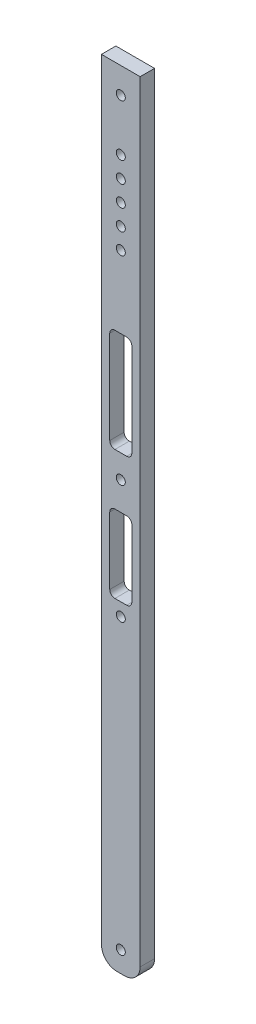
ISO-10303-21;
HEADER;
FILE_DESCRIPTION(('STEP AP214'),'2;1');
FILE_NAME('part.step','',(''),(''),'','','');
FILE_SCHEMA(('AUTOMOTIVE_DESIGN { 1 0 10303 214 1 1 1 1 }'));
ENDSEC;
DATA;
#1=APPLICATION_CONTEXT('core data for automotive mechanical design processes');
#2=APPLICATION_PROTOCOL_DEFINITION('international standard','automotive_design',2000,#1);
#3=PRODUCT_CONTEXT('',#1,'mechanical');
#4=PRODUCT('Part','Part','',(#3));
#5=PRODUCT_RELATED_PRODUCT_CATEGORY('part','',(#4));
#6=PRODUCT_DEFINITION_FORMATION('','',#4);
#7=PRODUCT_DEFINITION_CONTEXT('part definition',#1,'design');
#8=PRODUCT_DEFINITION('design','',#6,#7);
#9=PRODUCT_DEFINITION_SHAPE('','',#8);
#10=(LENGTH_UNIT() NAMED_UNIT(*) SI_UNIT(.MILLI.,.METRE.));
#11=(NAMED_UNIT(*) PLANE_ANGLE_UNIT() SI_UNIT($,.RADIAN.));
#12=(NAMED_UNIT(*) SI_UNIT($,.STERADIAN.) SOLID_ANGLE_UNIT());
#13=UNCERTAINTY_MEASURE_WITH_UNIT(LENGTH_MEASURE(1.E-05),#10,'distance_accuracy_value','');
#14=(GEOMETRIC_REPRESENTATION_CONTEXT(3) GLOBAL_UNCERTAINTY_ASSIGNED_CONTEXT((#13)) GLOBAL_UNIT_ASSIGNED_CONTEXT((#10,
#11,#12)) REPRESENTATION_CONTEXT('',''));
#15=CARTESIAN_POINT('',(0.,0.,0.));
#16=DIRECTION('',(0.,0.,1.));
#17=DIRECTION('',(1.,0.,0.));
#18=AXIS2_PLACEMENT_3D('',#15,#16,#17);
#19=CARTESIAN_POINT('',(-5.18917009837565,-216.502530885381,5.588));
#20=DIRECTION('',(1.,0.,0.));
#21=DIRECTION('',(0.,0.,-1.));
#22=AXIS2_PLACEMENT_3D('',#19,#20,#21);
#23=PLANE('',#22);
#24=DIRECTION('',(0.,-1.,0.));
#25=VECTOR('',#24,1.);
#26=CARTESIAN_POINT('',(-5.18917009837565,-216.502530885381,0.));
#27=LINE('',#26,#25);
#28=CARTESIAN_POINT('',(-5.18917009837565,88.2974691146191,0.));
#29=VERTEX_POINT('',#28);
#30=CARTESIAN_POINT('',(-5.18917009837565,-210.502530885381,0.));
#31=VERTEX_POINT('',#30);
#32=EDGE_CURVE('E373',#29,#31,#27,.T.);
#33=ORIENTED_EDGE('',*,*,#32,.T.);
#34=DIRECTION('',(0.,0.,-1.));
#35=VECTOR('',#34,1.);
#36=CARTESIAN_POINT('',(-5.18917009837565,-210.502530885381,5.588));
#37=LINE('',#36,#35);
#38=CARTESIAN_POINT('',(-5.18917009837565,-210.502530885381,5.588));
#39=VERTEX_POINT('',#38);
#40=EDGE_CURVE('E11',#31,#39,#37,.F.);
#41=ORIENTED_EDGE('',*,*,#40,.T.);
#42=DIRECTION('',(0.,-1.,0.));
#43=VECTOR('',#42,1.);
#44=CARTESIAN_POINT('',(-5.18917009837565,-216.502530885381,5.588));
#45=LINE('',#44,#43);
#46=CARTESIAN_POINT('',(-5.18917009837565,88.2974691146191,5.588));
#47=VERTEX_POINT('',#46);
#48=EDGE_CURVE('E376',#47,#39,#45,.T.);
#49=ORIENTED_EDGE('',*,*,#48,.F.);
#50=DIRECTION('',(0.,0.,-1.));
#51=VECTOR('',#50,1.);
#52=CARTESIAN_POINT('',(-5.18917009837565,88.2974691146191,5.588));
#53=LINE('',#52,#51);
#54=EDGE_CURVE('E385',#47,#29,#53,.T.);
#55=ORIENTED_EDGE('',*,*,#54,.T.);
#56=EDGE_LOOP('',(#33,#41,#49,#55));
#57=FACE_BOUND('',#56,.T.);
#58=ADVANCED_FACE('F33',(#57),#23,.F.);
#59=CARTESIAN_POINT('',(-5.18917009837565,-216.502530885381,5.588));
#60=DIRECTION('',(0.,1.,0.));
#61=DIRECTION('',(0.,0.,1.));
#62=AXIS2_PLACEMENT_3D('',#59,#60,#61);
#63=PLANE('',#62);
#64=DIRECTION('',(1.,0.,0.));
#65=VECTOR('',#64,1.);
#66=CARTESIAN_POINT('',(-5.18917009837565,-216.502530885381,0.));
#67=LINE('',#66,#65);
#68=CARTESIAN_POINT('',(0.810829901624352,-216.502530885381,0.));
#69=VERTEX_POINT('',#68);
#70=CARTESIAN_POINT('',(3.81082990162435,-216.502530885381,0.));
#71=VERTEX_POINT('',#70);
#72=EDGE_CURVE('E387',#69,#71,#67,.T.);
#73=ORIENTED_EDGE('',*,*,#72,.T.);
#74=DIRECTION('',(0.,0.,-1.));
#75=VECTOR('',#74,1.);
#76=CARTESIAN_POINT('',(3.81082990162435,-216.502530885381,5.588));
#77=LINE('',#76,#75);
#78=CARTESIAN_POINT('',(3.81082990162435,-216.502530885381,5.588));
#79=VERTEX_POINT('',#78);
#80=EDGE_CURVE('E54',#71,#79,#77,.F.);
#81=ORIENTED_EDGE('',*,*,#80,.T.);
#82=DIRECTION('',(1.,0.,0.));
#83=VECTOR('',#82,1.);
#84=CARTESIAN_POINT('',(-5.18917009837565,-216.502530885381,5.588));
#85=LINE('',#84,#83);
#86=CARTESIAN_POINT('',(0.810829901624352,-216.502530885381,5.588));
#87=VERTEX_POINT('',#86);
#88=EDGE_CURVE('E378',#87,#79,#85,.T.);
#89=ORIENTED_EDGE('',*,*,#88,.F.);
#90=DIRECTION('',(0.,0.,-1.));
#91=VECTOR('',#90,1.);
#92=CARTESIAN_POINT('',(0.810829901624352,-216.502530885381,5.588));
#93=LINE('',#92,#91);
#94=EDGE_CURVE('E404',#87,#69,#93,.T.);
#95=ORIENTED_EDGE('',*,*,#94,.T.);
#96=EDGE_LOOP('',(#73,#81,#89,#95));
#97=FACE_BOUND('',#96,.T.);
#98=ADVANCED_FACE('F424',(#97),#63,.F.);
#99=CARTESIAN_POINT('',(9.81082990162435,-216.502530885381,5.588));
#100=DIRECTION('',(-1.,0.,0.));
#101=DIRECTION('',(0.,0.,1.));
#102=AXIS2_PLACEMENT_3D('',#99,#100,#101);
#103=PLANE('',#102);
#104=DIRECTION('',(0.,1.,0.));
#105=VECTOR('',#104,1.);
#106=CARTESIAN_POINT('',(9.81082990162435,-216.502530885381,5.588));
#107=LINE('',#106,#105);
#108=CARTESIAN_POINT('',(9.81082990162435,-210.502530885381,5.588));
#109=VERTEX_POINT('',#108);
#110=CARTESIAN_POINT('',(9.81082990162435,88.2974691146191,5.588));
#111=VERTEX_POINT('',#110);
#112=EDGE_CURVE('E381',#109,#111,#107,.T.);
#113=ORIENTED_EDGE('',*,*,#112,.F.);
#114=DIRECTION('',(0.,0.,-1.));
#115=VECTOR('',#114,1.);
#116=CARTESIAN_POINT('',(9.81082990162435,-210.502530885381,5.588));
#117=LINE('',#116,#115);
#118=CARTESIAN_POINT('',(9.81082990162435,-210.502530885381,0.));
#119=VERTEX_POINT('',#118);
#120=EDGE_CURVE('E397',#109,#119,#117,.T.);
#121=ORIENTED_EDGE('',*,*,#120,.T.);
#122=DIRECTION('',(0.,1.,0.));
#123=VECTOR('',#122,1.);
#124=CARTESIAN_POINT('',(9.81082990162435,-216.502530885381,0.));
#125=LINE('',#124,#123);
#126=CARTESIAN_POINT('',(9.81082990162435,88.2974691146191,0.));
#127=VERTEX_POINT('',#126);
#128=EDGE_CURVE('E389',#119,#127,#125,.T.);
#129=ORIENTED_EDGE('',*,*,#128,.T.);
#130=DIRECTION('',(0.,0.,-1.));
#131=VECTOR('',#130,1.);
#132=CARTESIAN_POINT('',(9.81082990162435,88.2974691146191,5.588));
#133=LINE('',#132,#131);
#134=EDGE_CURVE('E394',#111,#127,#133,.T.);
#135=ORIENTED_EDGE('',*,*,#134,.F.);
#136=EDGE_LOOP('',(#113,#121,#129,#135));
#137=FACE_BOUND('',#136,.T.);
#138=ADVANCED_FACE('F417',(#137),#103,.F.);
#139=CARTESIAN_POINT('',(-5.18917009837565,88.2974691146191,5.588));
#140=DIRECTION('',(0.,-1.,0.));
#141=DIRECTION('',(0.,0.,-1.));
#142=AXIS2_PLACEMENT_3D('',#139,#140,#141);
#143=PLANE('',#142);
#144=DIRECTION('',(-1.,0.,0.));
#145=VECTOR('',#144,1.);
#146=CARTESIAN_POINT('',(-5.18917009837565,88.2974691146191,0.));
#147=LINE('',#146,#145);
#148=EDGE_CURVE('E379',#127,#29,#147,.T.);
#149=ORIENTED_EDGE('',*,*,#148,.T.);
#150=ORIENTED_EDGE('',*,*,#54,.F.);
#151=DIRECTION('',(-1.,0.,0.));
#152=VECTOR('',#151,1.);
#153=CARTESIAN_POINT('',(-5.18917009837565,88.2974691146191,5.588));
#154=LINE('',#153,#152);
#155=EDGE_CURVE('E383',#111,#47,#154,.T.);
#156=ORIENTED_EDGE('',*,*,#155,.F.);
#157=ORIENTED_EDGE('',*,*,#134,.T.);
#158=EDGE_LOOP('',(#149,#150,#156,#157));
#159=FACE_BOUND('',#158,.T.);
#160=ADVANCED_FACE('F431',(#159),#143,.F.);
#161=CARTESIAN_POINT('',(0.,0.,5.588));
#162=DIRECTION('',(0.,0.,-1.));
#163=DIRECTION('',(-1.,0.,0.));
#164=AXIS2_PLACEMENT_3D('',#161,#162,#163);
#165=PLANE('',#164);
#166=CARTESIAN_POINT('',(2.31082990162435,-208.502530885381,5.588));
#167=DIRECTION('',(0.,0.,1.));
#168=DIRECTION('',(1.,0.,0.));
#169=AXIS2_PLACEMENT_3D('',#166,#167,#168);
#170=CIRCLE('',#169,1.75);
#171=CARTESIAN_POINT('',(4.06082990162435,-208.502530885381,5.588));
#172=VERTEX_POINT('',#171);
#173=EDGE_CURVE('E216',#172,#172,#170,.T.);
#174=ORIENTED_EDGE('',*,*,#173,.F.);
#175=EDGE_LOOP('',(#174));
#176=FACE_BOUND('',#175,.T.);
#177=DIRECTION('',(0.,1.,0.));
#178=VECTOR('',#177,1.);
#179=CARTESIAN_POINT('',(6.59217705413511,-3.70253088538092,5.588));
#180=LINE('',#179,#178);
#181=CARTESIAN_POINT('',(6.59217705413512,-39.7025308853809,5.588));
#182=VERTEX_POINT('',#181);
#183=CARTESIAN_POINT('',(6.59217705413511,-3.70253088538092,5.588));
#184=VERTEX_POINT('',#183);
#185=EDGE_CURVE('E233',#182,#184,#180,.T.);
#186=ORIENTED_EDGE('',*,*,#185,.F.);
#187=CARTESIAN_POINT('',(4.59217705413512,-39.7025308853809,5.588));
#188=DIRECTION('',(0.,0.,1.));
#189=DIRECTION('',(-1.,0.,0.));
#190=AXIS2_PLACEMENT_3D('',#187,#188,#189);
#191=CIRCLE('',#190,2.);
#192=CARTESIAN_POINT('',(4.5921770541351,-41.7025308853809,5.588));
#193=VERTEX_POINT('',#192);
#194=EDGE_CURVE('E191',#193,#182,#191,.T.);
#195=ORIENTED_EDGE('',*,*,#194,.F.);
#196=DIRECTION('',(1.,0.,0.));
#197=VECTOR('',#196,1.);
#198=CARTESIAN_POINT('',(0.029482749113633,-41.7025308853809,5.588));
#199=LINE('',#198,#197);
#200=CARTESIAN_POINT('',(0.0294827491136326,-41.7025308853809,5.588));
#201=VERTEX_POINT('',#200);
#202=EDGE_CURVE('E210',#201,#193,#199,.T.);
#203=ORIENTED_EDGE('',*,*,#202,.F.);
#204=CARTESIAN_POINT('',(0.0294827491136187,-39.7025308853809,5.588));
#205=DIRECTION('',(0.,0.,1.));
#206=DIRECTION('',(1.,0.,0.));
#207=AXIS2_PLACEMENT_3D('',#204,#205,#206);
#208=CIRCLE('',#207,2.);
#209=CARTESIAN_POINT('',(-1.97051725088638,-39.7025308853809,5.588));
#210=VERTEX_POINT('',#209);
#211=EDGE_CURVE('E213',#210,#201,#208,.T.);
#212=ORIENTED_EDGE('',*,*,#211,.F.);
#213=DIRECTION('',(0.,-1.,0.));
#214=VECTOR('',#213,1.);
#215=CARTESIAN_POINT('',(-1.97051725088639,-3.70253088538092,5.588));
#216=LINE('',#215,#214);
#217=CARTESIAN_POINT('',(-1.97051725088639,-3.70253088538092,5.588));
#218=VERTEX_POINT('',#217);
#219=EDGE_CURVE('E245',#218,#210,#216,.T.);
#220=ORIENTED_EDGE('',*,*,#219,.F.);
#221=CARTESIAN_POINT('',(0.0294827491136148,-3.70253088538091,5.588));
#222=DIRECTION('',(0.,0.,1.));
#223=DIRECTION('',(1.,0.,0.));
#224=AXIS2_PLACEMENT_3D('',#221,#222,#223);
#225=CIRCLE('',#224,2.);
#226=CARTESIAN_POINT('',(0.0294827491136287,-1.70253088538091,5.588));
#227=VERTEX_POINT('',#226);
#228=EDGE_CURVE('E242',#227,#218,#225,.T.);
#229=ORIENTED_EDGE('',*,*,#228,.F.);
#230=DIRECTION('',(-1.,0.,0.));
#231=VECTOR('',#230,1.);
#232=CARTESIAN_POINT('',(0.0294827491136287,-1.70253088538091,5.588));
#233=LINE('',#232,#231);
#234=CARTESIAN_POINT('',(4.5921770541351,-1.70253088538091,5.588));
#235=VERTEX_POINT('',#234);
#236=EDGE_CURVE('E239',#235,#227,#233,.T.);
#237=ORIENTED_EDGE('',*,*,#236,.F.);
#238=CARTESIAN_POINT('',(4.59217705413511,-3.70253088538091,5.588));
#239=DIRECTION('',(0.,0.,1.));
#240=DIRECTION('',(1.,0.,0.));
#241=AXIS2_PLACEMENT_3D('',#238,#239,#240);
#242=CIRCLE('',#241,2.);
#243=EDGE_CURVE('E236',#184,#235,#242,.T.);
#244=ORIENTED_EDGE('',*,*,#243,.F.);
#245=EDGE_LOOP('',(#186,#195,#203,#212,#220,#229,#237,#244));
#246=FACE_BOUND('',#245,.T.);
#247=DIRECTION('',(0.,1.,0.));
#248=VECTOR('',#247,1.);
#249=CARTESIAN_POINT('',(6.59217705413512,-63.7025308853809,5.588));
#250=LINE('',#249,#248);
#251=CARTESIAN_POINT('',(6.59217705413512,-89.7025308853809,5.588));
#252=VERTEX_POINT('',#251);
#253=CARTESIAN_POINT('',(6.59217705413512,-63.7025308853809,5.588));
#254=VERTEX_POINT('',#253);
#255=EDGE_CURVE('E291',#252,#254,#250,.T.);
#256=ORIENTED_EDGE('',*,*,#255,.F.);
#257=CARTESIAN_POINT('',(4.59217705413512,-89.7025308853809,5.588));
#258=DIRECTION('',(0.,0.,1.));
#259=DIRECTION('',(1.,0.,0.));
#260=AXIS2_PLACEMENT_3D('',#257,#258,#259);
#261=CIRCLE('',#260,2.);
#262=CARTESIAN_POINT('',(4.59217705413511,-91.7025308853809,5.588));
#263=VERTEX_POINT('',#262);
#264=EDGE_CURVE('E252',#263,#252,#261,.T.);
#265=ORIENTED_EDGE('',*,*,#264,.F.);
#266=DIRECTION('',(1.,0.,0.));
#267=VECTOR('',#266,1.);
#268=CARTESIAN_POINT('',(0.0294827491136378,-91.7025308853809,5.588));
#269=LINE('',#268,#267);
#270=CARTESIAN_POINT('',(0.0294827491136378,-91.7025308853809,5.588));
#271=VERTEX_POINT('',#270);
#272=EDGE_CURVE('E268',#271,#263,#269,.T.);
#273=ORIENTED_EDGE('',*,*,#272,.F.);
#274=CARTESIAN_POINT('',(0.0294827491136239,-89.7025308853809,5.588));
#275=DIRECTION('',(0.,0.,1.));
#276=DIRECTION('',(1.,0.,0.));
#277=AXIS2_PLACEMENT_3D('',#274,#275,#276);
#278=CIRCLE('',#277,2.);
#279=CARTESIAN_POINT('',(-1.97051725088638,-89.7025308853809,5.588));
#280=VERTEX_POINT('',#279);
#281=EDGE_CURVE('E306',#280,#271,#278,.T.);
#282=ORIENTED_EDGE('',*,*,#281,.F.);
#283=DIRECTION('',(0.,-1.,0.));
#284=VECTOR('',#283,1.);
#285=CARTESIAN_POINT('',(-1.97051725088638,-63.7025308853809,5.588));
#286=LINE('',#285,#284);
#287=CARTESIAN_POINT('',(-1.97051725088638,-63.7025308853809,5.588));
#288=VERTEX_POINT('',#287);
#289=EDGE_CURVE('E303',#288,#280,#286,.T.);
#290=ORIENTED_EDGE('',*,*,#289,.F.);
#291=CARTESIAN_POINT('',(0.0294827491136205,-63.7025308853809,5.588));
#292=DIRECTION('',(0.,0.,1.));
#293=DIRECTION('',(1.,0.,0.));
#294=AXIS2_PLACEMENT_3D('',#291,#292,#293);
#295=CIRCLE('',#294,2.);
#296=CARTESIAN_POINT('',(0.0294827491136344,-61.7025308853809,5.588));
#297=VERTEX_POINT('',#296);
#298=EDGE_CURVE('E300',#297,#288,#295,.T.);
#299=ORIENTED_EDGE('',*,*,#298,.F.);
#300=DIRECTION('',(-1.,0.,0.));
#301=VECTOR('',#300,1.);
#302=CARTESIAN_POINT('',(0.0294827491136344,-61.7025308853809,5.588));
#303=LINE('',#302,#301);
#304=CARTESIAN_POINT('',(4.59217705413511,-61.7025308853809,5.588));
#305=VERTEX_POINT('',#304);
#306=EDGE_CURVE('E297',#305,#297,#303,.T.);
#307=ORIENTED_EDGE('',*,*,#306,.F.);
#308=CARTESIAN_POINT('',(4.59217705413512,-63.7025308853809,5.588));
#309=DIRECTION('',(0.,0.,1.));
#310=DIRECTION('',(-1.,0.,0.));
#311=AXIS2_PLACEMENT_3D('',#308,#309,#310);
#312=CIRCLE('',#311,2.);
#313=EDGE_CURVE('E294',#254,#305,#312,.T.);
#314=ORIENTED_EDGE('',*,*,#313,.F.);
#315=EDGE_LOOP('',(#256,#265,#273,#282,#290,#299,#307,#314));
#316=FACE_BOUND('',#315,.T.);
#317=CARTESIAN_POINT('',(2.31082990162437,-96.7025308853809,5.588));
#318=DIRECTION('',(0.,0.,1.));
#319=DIRECTION('',(1.,0.,0.));
#320=AXIS2_PLACEMENT_3D('',#317,#318,#319);
#321=CIRCLE('',#320,1.75);
#322=CARTESIAN_POINT('',(4.06082990162438,-96.7025308853809,5.588));
#323=VERTEX_POINT('',#322);
#324=EDGE_CURVE('E313',#323,#323,#321,.T.);
#325=ORIENTED_EDGE('',*,*,#324,.F.);
#326=EDGE_LOOP('',(#325));
#327=FACE_BOUND('',#326,.T.);
#328=CARTESIAN_POINT('',(2.31082990162437,-50.7628452094588,5.588));
#329=DIRECTION('',(0.,0.,1.));
#330=DIRECTION('',(1.,0.,0.));
#331=AXIS2_PLACEMENT_3D('',#328,#329,#330);
#332=CIRCLE('',#331,1.75);
#333=CARTESIAN_POINT('',(4.06082990162437,-50.7628452094588,5.588));
#334=VERTEX_POINT('',#333);
#335=EDGE_CURVE('E331',#334,#334,#332,.T.);
#336=ORIENTED_EDGE('',*,*,#335,.F.);
#337=EDGE_LOOP('',(#336));
#338=FACE_BOUND('',#337,.T.);
#339=CARTESIAN_POINT('',(2.31082990162436,26.2974691146191,5.588));
#340=DIRECTION('',(0.,0.,1.));
#341=DIRECTION('',(1.,0.,0.));
#342=AXIS2_PLACEMENT_3D('',#339,#340,#341);
#343=CIRCLE('',#342,1.75);
#344=CARTESIAN_POINT('',(4.06082990162436,26.2974691146191,5.588));
#345=VERTEX_POINT('',#344);
#346=EDGE_CURVE('E337',#345,#345,#343,.T.);
#347=ORIENTED_EDGE('',*,*,#346,.F.);
#348=EDGE_LOOP('',(#347));
#349=FACE_BOUND('',#348,.T.);
#350=CARTESIAN_POINT('',(2.31082990162436,34.2974691146191,5.588));
#351=DIRECTION('',(0.,0.,1.));
#352=DIRECTION('',(1.,0.,0.));
#353=AXIS2_PLACEMENT_3D('',#350,#351,#352);
#354=CIRCLE('',#353,1.75);
#355=CARTESIAN_POINT('',(4.06082990162436,34.2974691146191,5.588));
#356=VERTEX_POINT('',#355);
#357=EDGE_CURVE('E343',#356,#356,#354,.T.);
#358=ORIENTED_EDGE('',*,*,#357,.F.);
#359=EDGE_LOOP('',(#358));
#360=FACE_BOUND('',#359,.T.);
#361=CARTESIAN_POINT('',(2.31082990162436,42.2974691146191,5.588));
#362=DIRECTION('',(0.,0.,1.));
#363=DIRECTION('',(1.,0.,0.));
#364=AXIS2_PLACEMENT_3D('',#361,#362,#363);
#365=CIRCLE('',#364,1.75);
#366=CARTESIAN_POINT('',(4.06082990162436,42.2974691146191,5.588));
#367=VERTEX_POINT('',#366);
#368=EDGE_CURVE('E349',#367,#367,#365,.T.);
#369=ORIENTED_EDGE('',*,*,#368,.F.);
#370=EDGE_LOOP('',(#369));
#371=FACE_BOUND('',#370,.T.);
#372=CARTESIAN_POINT('',(2.31082990162436,50.2974691146191,5.588));
#373=DIRECTION('',(0.,0.,1.));
#374=DIRECTION('',(1.,0.,0.));
#375=AXIS2_PLACEMENT_3D('',#372,#373,#374);
#376=CIRCLE('',#375,1.75);
#377=CARTESIAN_POINT('',(4.06082990162436,50.2974691146191,5.588));
#378=VERTEX_POINT('',#377);
#379=EDGE_CURVE('E355',#378,#378,#376,.T.);
#380=ORIENTED_EDGE('',*,*,#379,.F.);
#381=EDGE_LOOP('',(#380));
#382=FACE_BOUND('',#381,.T.);
#383=CARTESIAN_POINT('',(2.31082990162436,58.2974691146191,5.588));
#384=DIRECTION('',(0.,0.,1.));
#385=DIRECTION('',(1.,0.,0.));
#386=AXIS2_PLACEMENT_3D('',#383,#384,#385);
#387=CIRCLE('',#386,1.75);
#388=CARTESIAN_POINT('',(4.06082990162436,58.2974691146191,5.588));
#389=VERTEX_POINT('',#388);
#390=EDGE_CURVE('E361',#389,#389,#387,.T.);
#391=ORIENTED_EDGE('',*,*,#390,.F.);
#392=EDGE_LOOP('',(#391));
#393=FACE_BOUND('',#392,.T.);
#394=CARTESIAN_POINT('',(2.31082990162435,78.2974691146191,5.588));
#395=DIRECTION('',(0.,0.,1.));
#396=DIRECTION('',(1.,0.,0.));
#397=AXIS2_PLACEMENT_3D('',#394,#395,#396);
#398=CIRCLE('',#397,1.75);
#399=CARTESIAN_POINT('',(4.06082990162435,78.2974691146191,5.588));
#400=VERTEX_POINT('',#399);
#401=EDGE_CURVE('E367',#400,#400,#398,.T.);
#402=ORIENTED_EDGE('',*,*,#401,.F.);
#403=EDGE_LOOP('',(#402));
#404=FACE_BOUND('',#403,.T.);
#405=ORIENTED_EDGE('',*,*,#88,.T.);
#406=CARTESIAN_POINT('',(3.81082990162435,-210.502530885381,5.588));
#407=DIRECTION('',(0.,0.,-1.));
#408=DIRECTION('',(-1.,0.,0.));
#409=AXIS2_PLACEMENT_3D('',#406,#407,#408);
#410=CIRCLE('',#409,6.);
#411=EDGE_CURVE('E41',#79,#109,#410,.F.);
#412=ORIENTED_EDGE('',*,*,#411,.T.);
#413=ORIENTED_EDGE('',*,*,#112,.T.);
#414=ORIENTED_EDGE('',*,*,#155,.T.);
#415=ORIENTED_EDGE('',*,*,#48,.T.);
#416=CARTESIAN_POINT('',(0.810829901624352,-210.502530885381,5.588));
#417=DIRECTION('',(0.,0.,-1.));
#418=DIRECTION('',(-1.,0.,0.));
#419=AXIS2_PLACEMENT_3D('',#416,#417,#418);
#420=CIRCLE('',#419,6.);
#421=EDGE_CURVE('E408',#39,#87,#420,.F.);
#422=ORIENTED_EDGE('',*,*,#421,.T.);
#423=EDGE_LOOP('',(#405,#412,#413,#414,#415,#422));
#424=FACE_BOUND('',#423,.T.);
#425=ADVANCED_FACE('F412',(#176,#246,#316,#327,#338,#349,#360,#371,#382,#393,#404,#424),#165,.F.);
#426=CARTESIAN_POINT('',(0.,0.,0.));
#427=DIRECTION('',(0.,0.,-1.));
#428=DIRECTION('',(-1.,0.,0.));
#429=AXIS2_PLACEMENT_3D('',#426,#427,#428);
#430=PLANE('',#429);
#431=CARTESIAN_POINT('',(2.31082990162435,-208.502530885381,0.));
#432=DIRECTION('',(0.,0.,1.));
#433=DIRECTION('',(1.,0.,0.));
#434=AXIS2_PLACEMENT_3D('',#431,#432,#433);
#435=CIRCLE('',#434,1.75);
#436=CARTESIAN_POINT('',(4.06082990162435,-208.502530885381,0.));
#437=VERTEX_POINT('',#436);
#438=EDGE_CURVE('E234',#437,#437,#435,.T.);
#439=ORIENTED_EDGE('',*,*,#438,.T.);
#440=EDGE_LOOP('',(#439));
#441=FACE_BOUND('',#440,.T.);
#442=CARTESIAN_POINT('',(4.59217705413512,-39.7025308853809,0.));
#443=DIRECTION('',(0.,0.,1.));
#444=DIRECTION('',(-1.,0.,0.));
#445=AXIS2_PLACEMENT_3D('',#442,#443,#444);
#446=CIRCLE('',#445,2.);
#447=CARTESIAN_POINT('',(4.5921770541351,-41.7025308853809,0.));
#448=VERTEX_POINT('',#447);
#449=CARTESIAN_POINT('',(6.59217705413512,-39.7025308853809,0.));
#450=VERTEX_POINT('',#449);
#451=EDGE_CURVE('E188',#448,#450,#446,.T.);
#452=ORIENTED_EDGE('',*,*,#451,.T.);
#453=DIRECTION('',(0.,1.,0.));
#454=VECTOR('',#453,1.);
#455=CARTESIAN_POINT('',(6.59217705413511,-3.70253088538092,0.));
#456=LINE('',#455,#454);
#457=CARTESIAN_POINT('',(6.59217705413511,-3.70253088538092,0.));
#458=VERTEX_POINT('',#457);
#459=EDGE_CURVE('E200',#450,#458,#456,.T.);
#460=ORIENTED_EDGE('',*,*,#459,.T.);
#461=CARTESIAN_POINT('',(4.59217705413511,-3.70253088538091,0.));
#462=DIRECTION('',(0.,0.,1.));
#463=DIRECTION('',(1.,0.,0.));
#464=AXIS2_PLACEMENT_3D('',#461,#462,#463);
#465=CIRCLE('',#464,2.);
#466=CARTESIAN_POINT('',(4.5921770541351,-1.70253088538091,0.));
#467=VERTEX_POINT('',#466);
#468=EDGE_CURVE('E204',#458,#467,#465,.T.);
#469=ORIENTED_EDGE('',*,*,#468,.T.);
#470=DIRECTION('',(-1.,0.,0.));
#471=VECTOR('',#470,1.);
#472=CARTESIAN_POINT('',(0.0294827491136287,-1.70253088538091,0.));
#473=LINE('',#472,#471);
#474=CARTESIAN_POINT('',(0.0294827491136287,-1.70253088538091,0.));
#475=VERTEX_POINT('',#474);
#476=EDGE_CURVE('E220',#467,#475,#473,.T.);
#477=ORIENTED_EDGE('',*,*,#476,.T.);
#478=CARTESIAN_POINT('',(0.0294827491136148,-3.70253088538091,0.));
#479=DIRECTION('',(0.,0.,1.));
#480=DIRECTION('',(1.,0.,0.));
#481=AXIS2_PLACEMENT_3D('',#478,#479,#480);
#482=CIRCLE('',#481,2.);
#483=CARTESIAN_POINT('',(-1.97051725088639,-3.70253088538092,0.));
#484=VERTEX_POINT('',#483);
#485=EDGE_CURVE('E223',#475,#484,#482,.T.);
#486=ORIENTED_EDGE('',*,*,#485,.T.);
#487=DIRECTION('',(0.,-1.,0.));
#488=VECTOR('',#487,1.);
#489=CARTESIAN_POINT('',(-1.97051725088639,-3.70253088538092,0.));
#490=LINE('',#489,#488);
#491=CARTESIAN_POINT('',(-1.97051725088638,-39.7025308853809,0.));
#492=VERTEX_POINT('',#491);
#493=EDGE_CURVE('E226',#484,#492,#490,.T.);
#494=ORIENTED_EDGE('',*,*,#493,.T.);
#495=CARTESIAN_POINT('',(0.0294827491136187,-39.7025308853809,0.));
#496=DIRECTION('',(0.,0.,1.));
#497=DIRECTION('',(1.,0.,0.));
#498=AXIS2_PLACEMENT_3D('',#495,#496,#497);
#499=CIRCLE('',#498,2.);
#500=CARTESIAN_POINT('',(0.0294827491136326,-41.7025308853809,0.));
#501=VERTEX_POINT('',#500);
#502=EDGE_CURVE('E229',#492,#501,#499,.T.);
#503=ORIENTED_EDGE('',*,*,#502,.T.);
#504=DIRECTION('',(1.,0.,0.));
#505=VECTOR('',#504,1.);
#506=CARTESIAN_POINT('',(0.029482749113633,-41.7025308853809,0.));
#507=LINE('',#506,#505);
#508=EDGE_CURVE('E196',#501,#448,#507,.T.);
#509=ORIENTED_EDGE('',*,*,#508,.T.);
#510=EDGE_LOOP('',(#452,#460,#469,#477,#486,#494,#503,#509));
#511=FACE_BOUND('',#510,.T.);
#512=CARTESIAN_POINT('',(4.59217705413512,-89.7025308853809,0.));
#513=DIRECTION('',(0.,0.,1.));
#514=DIRECTION('',(1.,0.,0.));
#515=AXIS2_PLACEMENT_3D('',#512,#513,#514);
#516=CIRCLE('',#515,2.);
#517=CARTESIAN_POINT('',(4.59217705413511,-91.7025308853809,0.));
#518=VERTEX_POINT('',#517);
#519=CARTESIAN_POINT('',(6.59217705413512,-89.7025308853809,0.));
#520=VERTEX_POINT('',#519);
#521=EDGE_CURVE('E264',#518,#520,#516,.T.);
#522=ORIENTED_EDGE('',*,*,#521,.T.);
#523=DIRECTION('',(0.,1.,0.));
#524=VECTOR('',#523,1.);
#525=CARTESIAN_POINT('',(6.59217705413512,-63.7025308853809,0.));
#526=LINE('',#525,#524);
#527=CARTESIAN_POINT('',(6.59217705413512,-63.7025308853809,0.));
#528=VERTEX_POINT('',#527);
#529=EDGE_CURVE('E267',#520,#528,#526,.T.);
#530=ORIENTED_EDGE('',*,*,#529,.T.);
#531=CARTESIAN_POINT('',(4.59217705413512,-63.7025308853809,0.));
#532=DIRECTION('',(0.,0.,1.));
#533=DIRECTION('',(-1.,0.,0.));
#534=AXIS2_PLACEMENT_3D('',#531,#532,#533);
#535=CIRCLE('',#534,2.);
#536=CARTESIAN_POINT('',(4.59217705413511,-61.7025308853809,0.));
#537=VERTEX_POINT('',#536);
#538=EDGE_CURVE('E271',#528,#537,#535,.T.);
#539=ORIENTED_EDGE('',*,*,#538,.T.);
#540=DIRECTION('',(-1.,0.,0.));
#541=VECTOR('',#540,1.);
#542=CARTESIAN_POINT('',(0.0294827491136344,-61.7025308853809,0.));
#543=LINE('',#542,#541);
#544=CARTESIAN_POINT('',(0.0294827491136344,-61.7025308853809,0.));
#545=VERTEX_POINT('',#544);
#546=EDGE_CURVE('E274',#537,#545,#543,.T.);
#547=ORIENTED_EDGE('',*,*,#546,.T.);
#548=CARTESIAN_POINT('',(0.0294827491136205,-63.7025308853809,0.));
#549=DIRECTION('',(0.,0.,1.));
#550=DIRECTION('',(1.,0.,0.));
#551=AXIS2_PLACEMENT_3D('',#548,#549,#550);
#552=CIRCLE('',#551,2.);
#553=CARTESIAN_POINT('',(-1.97051725088638,-63.7025308853809,0.));
#554=VERTEX_POINT('',#553);
#555=EDGE_CURVE('E277',#545,#554,#552,.T.);
#556=ORIENTED_EDGE('',*,*,#555,.T.);
#557=DIRECTION('',(0.,-1.,0.));
#558=VECTOR('',#557,1.);
#559=CARTESIAN_POINT('',(-1.97051725088638,-63.7025308853809,0.));
#560=LINE('',#559,#558);
#561=CARTESIAN_POINT('',(-1.97051725088638,-89.7025308853809,0.));
#562=VERTEX_POINT('',#561);
#563=EDGE_CURVE('E280',#554,#562,#560,.T.);
#564=ORIENTED_EDGE('',*,*,#563,.T.);
#565=CARTESIAN_POINT('',(0.0294827491136239,-89.7025308853809,0.));
#566=DIRECTION('',(0.,0.,1.));
#567=DIRECTION('',(1.,0.,0.));
#568=AXIS2_PLACEMENT_3D('',#565,#566,#567);
#569=CIRCLE('',#568,2.);
#570=CARTESIAN_POINT('',(0.0294827491136378,-91.7025308853809,0.));
#571=VERTEX_POINT('',#570);
#572=EDGE_CURVE('E283',#562,#571,#569,.T.);
#573=ORIENTED_EDGE('',*,*,#572,.T.);
#574=DIRECTION('',(1.,0.,0.));
#575=VECTOR('',#574,1.);
#576=CARTESIAN_POINT('',(0.0294827491136378,-91.7025308853809,0.));
#577=LINE('',#576,#575);
#578=EDGE_CURVE('E286',#571,#518,#577,.T.);
#579=ORIENTED_EDGE('',*,*,#578,.T.);
#580=EDGE_LOOP('',(#522,#530,#539,#547,#556,#564,#573,#579));
#581=FACE_BOUND('',#580,.T.);
#582=CARTESIAN_POINT('',(2.31082990162437,-96.7025308853809,0.));
#583=DIRECTION('',(0.,0.,1.));
#584=DIRECTION('',(1.,0.,0.));
#585=AXIS2_PLACEMENT_3D('',#582,#583,#584);
#586=CIRCLE('',#585,1.75);
#587=CARTESIAN_POINT('',(4.06082990162438,-96.7025308853809,0.));
#588=VERTEX_POINT('',#587);
#589=EDGE_CURVE('E328',#588,#588,#586,.T.);
#590=ORIENTED_EDGE('',*,*,#589,.T.);
#591=EDGE_LOOP('',(#590));
#592=FACE_BOUND('',#591,.T.);
#593=CARTESIAN_POINT('',(2.31082990162437,-50.7628452094588,0.));
#594=DIRECTION('',(0.,0.,1.));
#595=DIRECTION('',(1.,0.,0.));
#596=AXIS2_PLACEMENT_3D('',#593,#594,#595);
#597=CIRCLE('',#596,1.75);
#598=CARTESIAN_POINT('',(4.06082990162437,-50.7628452094588,0.));
#599=VERTEX_POINT('',#598);
#600=EDGE_CURVE('E334',#599,#599,#597,.T.);
#601=ORIENTED_EDGE('',*,*,#600,.T.);
#602=EDGE_LOOP('',(#601));
#603=FACE_BOUND('',#602,.T.);
#604=CARTESIAN_POINT('',(2.31082990162436,26.2974691146191,0.));
#605=DIRECTION('',(0.,0.,1.));
#606=DIRECTION('',(1.,0.,0.));
#607=AXIS2_PLACEMENT_3D('',#604,#605,#606);
#608=CIRCLE('',#607,1.75);
#609=CARTESIAN_POINT('',(4.06082990162436,26.2974691146191,0.));
#610=VERTEX_POINT('',#609);
#611=EDGE_CURVE('E340',#610,#610,#608,.T.);
#612=ORIENTED_EDGE('',*,*,#611,.T.);
#613=EDGE_LOOP('',(#612));
#614=FACE_BOUND('',#613,.T.);
#615=CARTESIAN_POINT('',(2.31082990162436,34.2974691146191,0.));
#616=DIRECTION('',(0.,0.,1.));
#617=DIRECTION('',(1.,0.,0.));
#618=AXIS2_PLACEMENT_3D('',#615,#616,#617);
#619=CIRCLE('',#618,1.75);
#620=CARTESIAN_POINT('',(4.06082990162436,34.2974691146191,0.));
#621=VERTEX_POINT('',#620);
#622=EDGE_CURVE('E346',#621,#621,#619,.T.);
#623=ORIENTED_EDGE('',*,*,#622,.T.);
#624=EDGE_LOOP('',(#623));
#625=FACE_BOUND('',#624,.T.);
#626=CARTESIAN_POINT('',(2.31082990162436,42.2974691146191,0.));
#627=DIRECTION('',(0.,0.,1.));
#628=DIRECTION('',(1.,0.,0.));
#629=AXIS2_PLACEMENT_3D('',#626,#627,#628);
#630=CIRCLE('',#629,1.75);
#631=CARTESIAN_POINT('',(4.06082990162436,42.2974691146191,0.));
#632=VERTEX_POINT('',#631);
#633=EDGE_CURVE('E352',#632,#632,#630,.T.);
#634=ORIENTED_EDGE('',*,*,#633,.T.);
#635=EDGE_LOOP('',(#634));
#636=FACE_BOUND('',#635,.T.);
#637=CARTESIAN_POINT('',(2.31082990162436,50.2974691146191,0.));
#638=DIRECTION('',(0.,0.,1.));
#639=DIRECTION('',(1.,0.,0.));
#640=AXIS2_PLACEMENT_3D('',#637,#638,#639);
#641=CIRCLE('',#640,1.75);
#642=CARTESIAN_POINT('',(4.06082990162436,50.2974691146191,0.));
#643=VERTEX_POINT('',#642);
#644=EDGE_CURVE('E358',#643,#643,#641,.T.);
#645=ORIENTED_EDGE('',*,*,#644,.T.);
#646=EDGE_LOOP('',(#645));
#647=FACE_BOUND('',#646,.T.);
#648=CARTESIAN_POINT('',(2.31082990162436,58.2974691146191,0.));
#649=DIRECTION('',(0.,0.,1.));
#650=DIRECTION('',(1.,0.,0.));
#651=AXIS2_PLACEMENT_3D('',#648,#649,#650);
#652=CIRCLE('',#651,1.75);
#653=CARTESIAN_POINT('',(4.06082990162436,58.2974691146191,0.));
#654=VERTEX_POINT('',#653);
#655=EDGE_CURVE('E364',#654,#654,#652,.T.);
#656=ORIENTED_EDGE('',*,*,#655,.T.);
#657=EDGE_LOOP('',(#656));
#658=FACE_BOUND('',#657,.T.);
#659=CARTESIAN_POINT('',(2.31082990162435,78.2974691146191,0.));
#660=DIRECTION('',(0.,0.,1.));
#661=DIRECTION('',(1.,0.,0.));
#662=AXIS2_PLACEMENT_3D('',#659,#660,#661);
#663=CIRCLE('',#662,1.75);
#664=CARTESIAN_POINT('',(4.06082990162435,78.2974691146191,0.));
#665=VERTEX_POINT('',#664);
#666=EDGE_CURVE('E370',#665,#665,#663,.T.);
#667=ORIENTED_EDGE('',*,*,#666,.T.);
#668=EDGE_LOOP('',(#667));
#669=FACE_BOUND('',#668,.T.);
#670=ORIENTED_EDGE('',*,*,#128,.F.);
#671=CARTESIAN_POINT('',(3.81082990162435,-210.502530885381,0.));
#672=DIRECTION('',(0.,0.,-1.));
#673=DIRECTION('',(-1.,0.,0.));
#674=AXIS2_PLACEMENT_3D('',#671,#672,#673);
#675=CIRCLE('',#674,6.);
#676=EDGE_CURVE('E402',#119,#71,#675,.T.);
#677=ORIENTED_EDGE('',*,*,#676,.T.);
#678=ORIENTED_EDGE('',*,*,#72,.F.);
#679=CARTESIAN_POINT('',(0.810829901624352,-210.502530885381,0.));
#680=DIRECTION('',(0.,0.,-1.));
#681=DIRECTION('',(-1.,0.,0.));
#682=AXIS2_PLACEMENT_3D('',#679,#680,#681);
#683=CIRCLE('',#682,6.);
#684=EDGE_CURVE('E400',#69,#31,#683,.T.);
#685=ORIENTED_EDGE('',*,*,#684,.T.);
#686=ORIENTED_EDGE('',*,*,#32,.F.);
#687=ORIENTED_EDGE('',*,*,#148,.F.);
#688=EDGE_LOOP('',(#670,#677,#678,#685,#686,#687));
#689=FACE_BOUND('',#688,.T.);
#690=ADVANCED_FACE('F206',(#441,#511,#581,#592,#603,#614,#625,#636,#647,#658,#669,#689),#430,.T.);
#691=CARTESIAN_POINT('',(2.31082990162435,78.2974691146191,0.));
#692=DIRECTION('',(0.,0.,1.));
#693=DIRECTION('',(1.,0.,0.));
#694=AXIS2_PLACEMENT_3D('',#691,#692,#693);
#695=CYLINDRICAL_SURFACE('',#694,1.75);
#696=ORIENTED_EDGE('',*,*,#666,.F.);
#697=EDGE_LOOP('',(#696));
#698=FACE_BOUND('',#697,.T.);
#699=ORIENTED_EDGE('',*,*,#401,.T.);
#700=EDGE_LOOP('',(#699));
#701=FACE_BOUND('',#700,.T.);
#702=ADVANCED_FACE('F548',(#698,#701),#695,.F.);
#703=CARTESIAN_POINT('',(2.31082990162436,58.2974691146191,0.));
#704=DIRECTION('',(0.,0.,1.));
#705=DIRECTION('',(1.,0.,0.));
#706=AXIS2_PLACEMENT_3D('',#703,#704,#705);
#707=CYLINDRICAL_SURFACE('',#706,1.75);
#708=ORIENTED_EDGE('',*,*,#655,.F.);
#709=EDGE_LOOP('',(#708));
#710=FACE_BOUND('',#709,.T.);
#711=ORIENTED_EDGE('',*,*,#390,.T.);
#712=EDGE_LOOP('',(#711));
#713=FACE_BOUND('',#712,.T.);
#714=ADVANCED_FACE('F544',(#710,#713),#707,.F.);
#715=CARTESIAN_POINT('',(2.31082990162436,50.2974691146191,0.));
#716=DIRECTION('',(0.,0.,1.));
#717=DIRECTION('',(1.,0.,0.));
#718=AXIS2_PLACEMENT_3D('',#715,#716,#717);
#719=CYLINDRICAL_SURFACE('',#718,1.75);
#720=ORIENTED_EDGE('',*,*,#644,.F.);
#721=EDGE_LOOP('',(#720));
#722=FACE_BOUND('',#721,.T.);
#723=ORIENTED_EDGE('',*,*,#379,.T.);
#724=EDGE_LOOP('',(#723));
#725=FACE_BOUND('',#724,.T.);
#726=ADVANCED_FACE('F540',(#722,#725),#719,.F.);
#727=CARTESIAN_POINT('',(2.31082990162436,42.2974691146191,0.));
#728=DIRECTION('',(0.,0.,1.));
#729=DIRECTION('',(1.,0.,0.));
#730=AXIS2_PLACEMENT_3D('',#727,#728,#729);
#731=CYLINDRICAL_SURFACE('',#730,1.75);
#732=ORIENTED_EDGE('',*,*,#633,.F.);
#733=EDGE_LOOP('',(#732));
#734=FACE_BOUND('',#733,.T.);
#735=ORIENTED_EDGE('',*,*,#368,.T.);
#736=EDGE_LOOP('',(#735));
#737=FACE_BOUND('',#736,.T.);
#738=ADVANCED_FACE('F536',(#734,#737),#731,.F.);
#739=CARTESIAN_POINT('',(2.31082990162436,34.2974691146191,0.));
#740=DIRECTION('',(0.,0.,1.));
#741=DIRECTION('',(1.,0.,0.));
#742=AXIS2_PLACEMENT_3D('',#739,#740,#741);
#743=CYLINDRICAL_SURFACE('',#742,1.75);
#744=ORIENTED_EDGE('',*,*,#622,.F.);
#745=EDGE_LOOP('',(#744));
#746=FACE_BOUND('',#745,.T.);
#747=ORIENTED_EDGE('',*,*,#357,.T.);
#748=EDGE_LOOP('',(#747));
#749=FACE_BOUND('',#748,.T.);
#750=ADVANCED_FACE('F532',(#746,#749),#743,.F.);
#751=CARTESIAN_POINT('',(2.31082990162436,26.2974691146191,0.));
#752=DIRECTION('',(0.,0.,1.));
#753=DIRECTION('',(1.,0.,0.));
#754=AXIS2_PLACEMENT_3D('',#751,#752,#753);
#755=CYLINDRICAL_SURFACE('',#754,1.75);
#756=ORIENTED_EDGE('',*,*,#611,.F.);
#757=EDGE_LOOP('',(#756));
#758=FACE_BOUND('',#757,.T.);
#759=ORIENTED_EDGE('',*,*,#346,.T.);
#760=EDGE_LOOP('',(#759));
#761=FACE_BOUND('',#760,.T.);
#762=ADVANCED_FACE('F528',(#758,#761),#755,.F.);
#763=CARTESIAN_POINT('',(2.31082990162437,-50.7628452094588,0.));
#764=DIRECTION('',(0.,0.,1.));
#765=DIRECTION('',(1.,0.,0.));
#766=AXIS2_PLACEMENT_3D('',#763,#764,#765);
#767=CYLINDRICAL_SURFACE('',#766,1.75);
#768=ORIENTED_EDGE('',*,*,#600,.F.);
#769=EDGE_LOOP('',(#768));
#770=FACE_BOUND('',#769,.T.);
#771=ORIENTED_EDGE('',*,*,#335,.T.);
#772=EDGE_LOOP('',(#771));
#773=FACE_BOUND('',#772,.T.);
#774=ADVANCED_FACE('F524',(#770,#773),#767,.F.);
#775=CARTESIAN_POINT('',(2.31082990162437,-96.7025308853809,0.));
#776=DIRECTION('',(0.,0.,1.));
#777=DIRECTION('',(1.,0.,0.));
#778=AXIS2_PLACEMENT_3D('',#775,#776,#777);
#779=CYLINDRICAL_SURFACE('',#778,1.75);
#780=ORIENTED_EDGE('',*,*,#589,.F.);
#781=EDGE_LOOP('',(#780));
#782=FACE_BOUND('',#781,.T.);
#783=ORIENTED_EDGE('',*,*,#324,.T.);
#784=EDGE_LOOP('',(#783));
#785=FACE_BOUND('',#784,.T.);
#786=ADVANCED_FACE('F520',(#782,#785),#779,.F.);
#787=CARTESIAN_POINT('',(4.59217705413512,-89.7025308853809,0.));
#788=DIRECTION('',(0.,0.,1.));
#789=DIRECTION('',(1.,0.,0.));
#790=AXIS2_PLACEMENT_3D('',#787,#788,#789);
#791=CYLINDRICAL_SURFACE('',#790,2.);
#792=ORIENTED_EDGE('',*,*,#264,.T.);
#793=DIRECTION('',(0.,0.,1.));
#794=VECTOR('',#793,1.);
#795=CARTESIAN_POINT('',(6.59217705413512,-89.7025308853809,0.));
#796=LINE('',#795,#794);
#797=EDGE_CURVE('E289',#520,#252,#796,.T.);
#798=ORIENTED_EDGE('',*,*,#797,.F.);
#799=ORIENTED_EDGE('',*,*,#521,.F.);
#800=DIRECTION('',(0.,0.,1.));
#801=VECTOR('',#800,1.);
#802=CARTESIAN_POINT('',(4.59217705413511,-91.7025308853809,0.));
#803=LINE('',#802,#801);
#804=EDGE_CURVE('E311',#518,#263,#803,.T.);
#805=ORIENTED_EDGE('',*,*,#804,.T.);
#806=EDGE_LOOP('',(#792,#798,#799,#805));
#807=FACE_BOUND('',#806,.T.);
#808=ADVANCED_FACE('F494',(#807),#791,.F.);
#809=CARTESIAN_POINT('',(0.0294827491136378,-91.7025308853809,0.));
#810=DIRECTION('',(0.,-1.,0.));
#811=DIRECTION('',(0.,0.,-1.));
#812=AXIS2_PLACEMENT_3D('',#809,#810,#811);
#813=PLANE('',#812);
#814=ORIENTED_EDGE('',*,*,#272,.T.);
#815=ORIENTED_EDGE('',*,*,#804,.F.);
#816=ORIENTED_EDGE('',*,*,#578,.F.);
#817=DIRECTION('',(0.,0.,1.));
#818=VECTOR('',#817,1.);
#819=CARTESIAN_POINT('',(0.0294827491136378,-91.7025308853809,0.));
#820=LINE('',#819,#818);
#821=EDGE_CURVE('E314',#571,#271,#820,.T.);
#822=ORIENTED_EDGE('',*,*,#821,.T.);
#823=EDGE_LOOP('',(#814,#815,#816,#822));
#824=FACE_BOUND('',#823,.T.);
#825=ADVANCED_FACE('F490',(#824),#813,.F.);
#826=CARTESIAN_POINT('',(0.0294827491136239,-89.7025308853809,0.));
#827=DIRECTION('',(0.,0.,1.));
#828=DIRECTION('',(1.,0.,0.));
#829=AXIS2_PLACEMENT_3D('',#826,#827,#828);
#830=CYLINDRICAL_SURFACE('',#829,2.);
#831=ORIENTED_EDGE('',*,*,#281,.T.);
#832=ORIENTED_EDGE('',*,*,#821,.F.);
#833=ORIENTED_EDGE('',*,*,#572,.F.);
#834=DIRECTION('',(0.,0.,1.));
#835=VECTOR('',#834,1.);
#836=CARTESIAN_POINT('',(-1.97051725088638,-89.7025308853809,0.));
#837=LINE('',#836,#835);
#838=EDGE_CURVE('E316',#562,#280,#837,.T.);
#839=ORIENTED_EDGE('',*,*,#838,.T.);
#840=EDGE_LOOP('',(#831,#832,#833,#839));
#841=FACE_BOUND('',#840,.T.);
#842=ADVANCED_FACE('F493',(#841),#830,.F.);
#843=CARTESIAN_POINT('',(-1.97051725088638,-63.7025308853809,0.));
#844=DIRECTION('',(-1.,0.,0.));
#845=DIRECTION('',(0.,-1.,0.));
#846=AXIS2_PLACEMENT_3D('',#843,#844,#845);
#847=PLANE('',#846);
#848=ORIENTED_EDGE('',*,*,#289,.T.);
#849=ORIENTED_EDGE('',*,*,#838,.F.);
#850=ORIENTED_EDGE('',*,*,#563,.F.);
#851=DIRECTION('',(0.,0.,1.));
#852=VECTOR('',#851,1.);
#853=CARTESIAN_POINT('',(-1.97051725088638,-63.7025308853809,0.));
#854=LINE('',#853,#852);
#855=EDGE_CURVE('E318',#554,#288,#854,.T.);
#856=ORIENTED_EDGE('',*,*,#855,.T.);
#857=EDGE_LOOP('',(#848,#849,#850,#856));
#858=FACE_BOUND('',#857,.T.);
#859=ADVANCED_FACE('F498',(#858),#847,.F.);
#860=CARTESIAN_POINT('',(0.0294827491136205,-63.7025308853809,0.));
#861=DIRECTION('',(0.,0.,1.));
#862=DIRECTION('',(1.,0.,0.));
#863=AXIS2_PLACEMENT_3D('',#860,#861,#862);
#864=CYLINDRICAL_SURFACE('',#863,2.);
#865=ORIENTED_EDGE('',*,*,#298,.T.);
#866=ORIENTED_EDGE('',*,*,#855,.F.);
#867=ORIENTED_EDGE('',*,*,#555,.F.);
#868=DIRECTION('',(0.,0.,1.));
#869=VECTOR('',#868,1.);
#870=CARTESIAN_POINT('',(0.0294827491136344,-61.7025308853809,0.));
#871=LINE('',#870,#869);
#872=EDGE_CURVE('E320',#545,#297,#871,.T.);
#873=ORIENTED_EDGE('',*,*,#872,.T.);
#874=EDGE_LOOP('',(#865,#866,#867,#873));
#875=FACE_BOUND('',#874,.T.);
#876=ADVANCED_FACE('F502',(#875),#864,.F.);
#877=CARTESIAN_POINT('',(0.0294827491136344,-61.7025308853809,0.));
#878=DIRECTION('',(0.,1.,0.));
#879=DIRECTION('',(0.,0.,1.));
#880=AXIS2_PLACEMENT_3D('',#877,#878,#879);
#881=PLANE('',#880);
#882=ORIENTED_EDGE('',*,*,#306,.T.);
#883=ORIENTED_EDGE('',*,*,#872,.F.);
#884=ORIENTED_EDGE('',*,*,#546,.F.);
#885=DIRECTION('',(0.,0.,1.));
#886=VECTOR('',#885,1.);
#887=CARTESIAN_POINT('',(4.59217705413511,-61.7025308853809,0.));
#888=LINE('',#887,#886);
#889=EDGE_CURVE('E322',#537,#305,#888,.T.);
#890=ORIENTED_EDGE('',*,*,#889,.T.);
#891=EDGE_LOOP('',(#882,#883,#884,#890));
#892=FACE_BOUND('',#891,.T.);
#893=ADVANCED_FACE('F506',(#892),#881,.F.);
#894=CARTESIAN_POINT('',(4.59217705413512,-63.7025308853809,0.));
#895=DIRECTION('',(0.,0.,1.));
#896=DIRECTION('',(1.,0.,0.));
#897=AXIS2_PLACEMENT_3D('',#894,#895,#896);
#898=CYLINDRICAL_SURFACE('',#897,2.);
#899=ORIENTED_EDGE('',*,*,#313,.T.);
#900=ORIENTED_EDGE('',*,*,#889,.F.);
#901=ORIENTED_EDGE('',*,*,#538,.F.);
#902=DIRECTION('',(0.,0.,1.));
#903=VECTOR('',#902,1.);
#904=CARTESIAN_POINT('',(6.59217705413512,-63.7025308853809,0.));
#905=LINE('',#904,#903);
#906=EDGE_CURVE('E324',#528,#254,#905,.T.);
#907=ORIENTED_EDGE('',*,*,#906,.T.);
#908=EDGE_LOOP('',(#899,#900,#901,#907));
#909=FACE_BOUND('',#908,.T.);
#910=ADVANCED_FACE('F510',(#909),#898,.F.);
#911=CARTESIAN_POINT('',(6.59217705413512,-63.7025308853809,0.));
#912=DIRECTION('',(1.,0.,0.));
#913=DIRECTION('',(0.,1.,0.));
#914=AXIS2_PLACEMENT_3D('',#911,#912,#913);
#915=PLANE('',#914);
#916=ORIENTED_EDGE('',*,*,#255,.T.);
#917=ORIENTED_EDGE('',*,*,#906,.F.);
#918=ORIENTED_EDGE('',*,*,#529,.F.);
#919=ORIENTED_EDGE('',*,*,#797,.T.);
#920=EDGE_LOOP('',(#916,#917,#918,#919));
#921=FACE_BOUND('',#920,.T.);
#922=ADVANCED_FACE('F489',(#921),#915,.F.);
#923=CARTESIAN_POINT('',(4.59217705413512,-39.7025308853809,0.));
#924=DIRECTION('',(0.,0.,1.));
#925=DIRECTION('',(1.,0.,0.));
#926=AXIS2_PLACEMENT_3D('',#923,#924,#925);
#927=CYLINDRICAL_SURFACE('',#926,2.);
#928=ORIENTED_EDGE('',*,*,#194,.T.);
#929=DIRECTION('',(0.,0.,1.));
#930=VECTOR('',#929,1.);
#931=CARTESIAN_POINT('',(6.59217705413512,-39.7025308853809,0.));
#932=LINE('',#931,#930);
#933=EDGE_CURVE('E184',#450,#182,#932,.T.);
#934=ORIENTED_EDGE('',*,*,#933,.F.);
#935=ORIENTED_EDGE('',*,*,#451,.F.);
#936=DIRECTION('',(0.,0.,1.));
#937=VECTOR('',#936,1.);
#938=CARTESIAN_POINT('',(4.5921770541351,-41.7025308853809,0.));
#939=LINE('',#938,#937);
#940=EDGE_CURVE('E250',#448,#193,#939,.T.);
#941=ORIENTED_EDGE('',*,*,#940,.T.);
#942=EDGE_LOOP('',(#928,#934,#935,#941));
#943=FACE_BOUND('',#942,.T.);
#944=ADVANCED_FACE('F186',(#943),#927,.F.);
#945=CARTESIAN_POINT('',(0.029482749113633,-41.7025308853809,0.));
#946=DIRECTION('',(0.,-1.,0.));
#947=DIRECTION('',(0.,0.,-1.));
#948=AXIS2_PLACEMENT_3D('',#945,#946,#947);
#949=PLANE('',#948);
#950=ORIENTED_EDGE('',*,*,#202,.T.);
#951=ORIENTED_EDGE('',*,*,#940,.F.);
#952=ORIENTED_EDGE('',*,*,#508,.F.);
#953=DIRECTION('',(0.,0.,1.));
#954=VECTOR('',#953,1.);
#955=CARTESIAN_POINT('',(0.0294827491136326,-41.7025308853809,0.));
#956=LINE('',#955,#954);
#957=EDGE_CURVE('E253',#501,#201,#956,.T.);
#958=ORIENTED_EDGE('',*,*,#957,.T.);
#959=EDGE_LOOP('',(#950,#951,#952,#958));
#960=FACE_BOUND('',#959,.T.);
#961=ADVANCED_FACE('F464',(#960),#949,.F.);
#962=CARTESIAN_POINT('',(0.0294827491136187,-39.7025308853809,0.));
#963=DIRECTION('',(0.,0.,1.));
#964=DIRECTION('',(1.,0.,0.));
#965=AXIS2_PLACEMENT_3D('',#962,#963,#964);
#966=CYLINDRICAL_SURFACE('',#965,2.);
#967=ORIENTED_EDGE('',*,*,#211,.T.);
#968=ORIENTED_EDGE('',*,*,#957,.F.);
#969=ORIENTED_EDGE('',*,*,#502,.F.);
#970=DIRECTION('',(0.,0.,1.));
#971=VECTOR('',#970,1.);
#972=CARTESIAN_POINT('',(-1.97051725088638,-39.7025308853809,0.));
#973=LINE('',#972,#971);
#974=EDGE_CURVE('E255',#492,#210,#973,.T.);
#975=ORIENTED_EDGE('',*,*,#974,.T.);
#976=EDGE_LOOP('',(#967,#968,#969,#975));
#977=FACE_BOUND('',#976,.T.);
#978=ADVANCED_FACE('F467',(#977),#966,.F.);
#979=CARTESIAN_POINT('',(-1.97051725088639,-3.70253088538092,0.));
#980=DIRECTION('',(-1.,0.,0.));
#981=DIRECTION('',(0.,-1.,0.));
#982=AXIS2_PLACEMENT_3D('',#979,#980,#981);
#983=PLANE('',#982);
#984=ORIENTED_EDGE('',*,*,#219,.T.);
#985=ORIENTED_EDGE('',*,*,#974,.F.);
#986=ORIENTED_EDGE('',*,*,#493,.F.);
#987=DIRECTION('',(0.,0.,1.));
#988=VECTOR('',#987,1.);
#989=CARTESIAN_POINT('',(-1.97051725088639,-3.70253088538092,0.));
#990=LINE('',#989,#988);
#991=EDGE_CURVE('E257',#484,#218,#990,.T.);
#992=ORIENTED_EDGE('',*,*,#991,.T.);
#993=EDGE_LOOP('',(#984,#985,#986,#992));
#994=FACE_BOUND('',#993,.T.);
#995=ADVANCED_FACE('F471',(#994),#983,.F.);
#996=CARTESIAN_POINT('',(0.0294827491136148,-3.70253088538091,0.));
#997=DIRECTION('',(0.,0.,1.));
#998=DIRECTION('',(1.,0.,0.));
#999=AXIS2_PLACEMENT_3D('',#996,#997,#998);
#1000=CYLINDRICAL_SURFACE('',#999,2.);
#1001=ORIENTED_EDGE('',*,*,#228,.T.);
#1002=ORIENTED_EDGE('',*,*,#991,.F.);
#1003=ORIENTED_EDGE('',*,*,#485,.F.);
#1004=DIRECTION('',(0.,0.,1.));
#1005=VECTOR('',#1004,1.);
#1006=CARTESIAN_POINT('',(0.0294827491136287,-1.70253088538091,0.));
#1007=LINE('',#1006,#1005);
#1008=EDGE_CURVE('E259',#475,#227,#1007,.T.);
#1009=ORIENTED_EDGE('',*,*,#1008,.T.);
#1010=EDGE_LOOP('',(#1001,#1002,#1003,#1009));
#1011=FACE_BOUND('',#1010,.T.);
#1012=ADVANCED_FACE('F475',(#1011),#1000,.F.);
#1013=CARTESIAN_POINT('',(0.0294827491136287,-1.70253088538091,0.));
#1014=DIRECTION('',(0.,1.,0.));
#1015=DIRECTION('',(-1.,0.,0.));
#1016=AXIS2_PLACEMENT_3D('',#1013,#1014,#1015);
#1017=PLANE('',#1016);
#1018=ORIENTED_EDGE('',*,*,#236,.T.);
#1019=ORIENTED_EDGE('',*,*,#1008,.F.);
#1020=ORIENTED_EDGE('',*,*,#476,.F.);
#1021=DIRECTION('',(0.,0.,1.));
#1022=VECTOR('',#1021,1.);
#1023=CARTESIAN_POINT('',(4.5921770541351,-1.70253088538091,0.));
#1024=LINE('',#1023,#1022);
#1025=EDGE_CURVE('E261',#467,#235,#1024,.T.);
#1026=ORIENTED_EDGE('',*,*,#1025,.T.);
#1027=EDGE_LOOP('',(#1018,#1019,#1020,#1026));
#1028=FACE_BOUND('',#1027,.T.);
#1029=ADVANCED_FACE('F479',(#1028),#1017,.F.);
#1030=CARTESIAN_POINT('',(4.59217705413511,-3.70253088538091,0.));
#1031=DIRECTION('',(0.,0.,1.));
#1032=DIRECTION('',(1.,0.,0.));
#1033=AXIS2_PLACEMENT_3D('',#1030,#1031,#1032);
#1034=CYLINDRICAL_SURFACE('',#1033,2.);
#1035=ORIENTED_EDGE('',*,*,#243,.T.);
#1036=ORIENTED_EDGE('',*,*,#1025,.F.);
#1037=ORIENTED_EDGE('',*,*,#468,.F.);
#1038=DIRECTION('',(0.,0.,1.));
#1039=VECTOR('',#1038,1.);
#1040=CARTESIAN_POINT('',(6.59217705413511,-3.70253088538092,0.));
#1041=LINE('',#1040,#1039);
#1042=EDGE_CURVE('E195',#458,#184,#1041,.T.);
#1043=ORIENTED_EDGE('',*,*,#1042,.T.);
#1044=EDGE_LOOP('',(#1035,#1036,#1037,#1043));
#1045=FACE_BOUND('',#1044,.T.);
#1046=ADVANCED_FACE('F459',(#1045),#1034,.F.);
#1047=CARTESIAN_POINT('',(6.59217705413511,-3.70253088538092,0.));
#1048=DIRECTION('',(1.,0.,0.));
#1049=DIRECTION('',(0.,1.,0.));
#1050=AXIS2_PLACEMENT_3D('',#1047,#1048,#1049);
#1051=PLANE('',#1050);
#1052=ORIENTED_EDGE('',*,*,#185,.T.);
#1053=ORIENTED_EDGE('',*,*,#1042,.F.);
#1054=ORIENTED_EDGE('',*,*,#459,.F.);
#1055=ORIENTED_EDGE('',*,*,#933,.T.);
#1056=EDGE_LOOP('',(#1052,#1053,#1054,#1055));
#1057=FACE_BOUND('',#1056,.T.);
#1058=ADVANCED_FACE('F201',(#1057),#1051,.F.);
#1059=CARTESIAN_POINT('',(2.31082990162435,-208.502530885381,0.));
#1060=DIRECTION('',(0.,0.,1.));
#1061=DIRECTION('',(1.,0.,0.));
#1062=AXIS2_PLACEMENT_3D('',#1059,#1060,#1061);
#1063=CYLINDRICAL_SURFACE('',#1062,1.75);
#1064=ORIENTED_EDGE('',*,*,#438,.F.);
#1065=EDGE_LOOP('',(#1064));
#1066=FACE_BOUND('',#1065,.T.);
#1067=ORIENTED_EDGE('',*,*,#173,.T.);
#1068=EDGE_LOOP('',(#1067));
#1069=FACE_BOUND('',#1068,.T.);
#1070=ADVANCED_FACE('F449',(#1066,#1069),#1063,.F.);
#1071=CARTESIAN_POINT('',(3.81082990162435,-210.502530885381,5.588));
#1072=DIRECTION('',(0.,0.,-1.));
#1073=DIRECTION('',(-1.,0.,0.));
#1074=AXIS2_PLACEMENT_3D('',#1071,#1072,#1073);
#1075=CYLINDRICAL_SURFACE('',#1074,6.);
#1076=ORIENTED_EDGE('',*,*,#411,.F.);
#1077=ORIENTED_EDGE('',*,*,#80,.F.);
#1078=ORIENTED_EDGE('',*,*,#676,.F.);
#1079=ORIENTED_EDGE('',*,*,#120,.F.);
#1080=EDGE_LOOP('',(#1076,#1077,#1078,#1079));
#1081=FACE_BOUND('',#1080,.T.);
#1082=ADVANCED_FACE('F420',(#1081),#1075,.T.);
#1083=CARTESIAN_POINT('',(0.810829901624352,-210.502530885381,5.588));
#1084=DIRECTION('',(0.,0.,-1.));
#1085=DIRECTION('',(-1.,0.,0.));
#1086=AXIS2_PLACEMENT_3D('',#1083,#1084,#1085);
#1087=CYLINDRICAL_SURFACE('',#1086,6.);
#1088=ORIENTED_EDGE('',*,*,#421,.F.);
#1089=ORIENTED_EDGE('',*,*,#40,.F.);
#1090=ORIENTED_EDGE('',*,*,#684,.F.);
#1091=ORIENTED_EDGE('',*,*,#94,.F.);
#1092=EDGE_LOOP('',(#1088,#1089,#1090,#1091));
#1093=FACE_BOUND('',#1092,.T.);
#1094=ADVANCED_FACE('F35',(#1093),#1087,.T.);
#1095=CLOSED_SHELL('',(#58,#98,#138,#160,#425,#690,#702,#714,#726,#738,#750,#762,#774,#786,#808,
#825,#842,#859,#876,#893,#910,#922,#944,#961,#978,#995,#1012,#1029,#1046,#1058,#1070,#1082,#1094));
#1096=MANIFOLD_SOLID_BREP('B2',#1095);
#1097=ADVANCED_BREP_SHAPE_REPRESENTATION('',(#18,#1096),#14);
#1098=SHAPE_DEFINITION_REPRESENTATION(#9,#1097);
ENDSEC;
END-ISO-10303-21;
